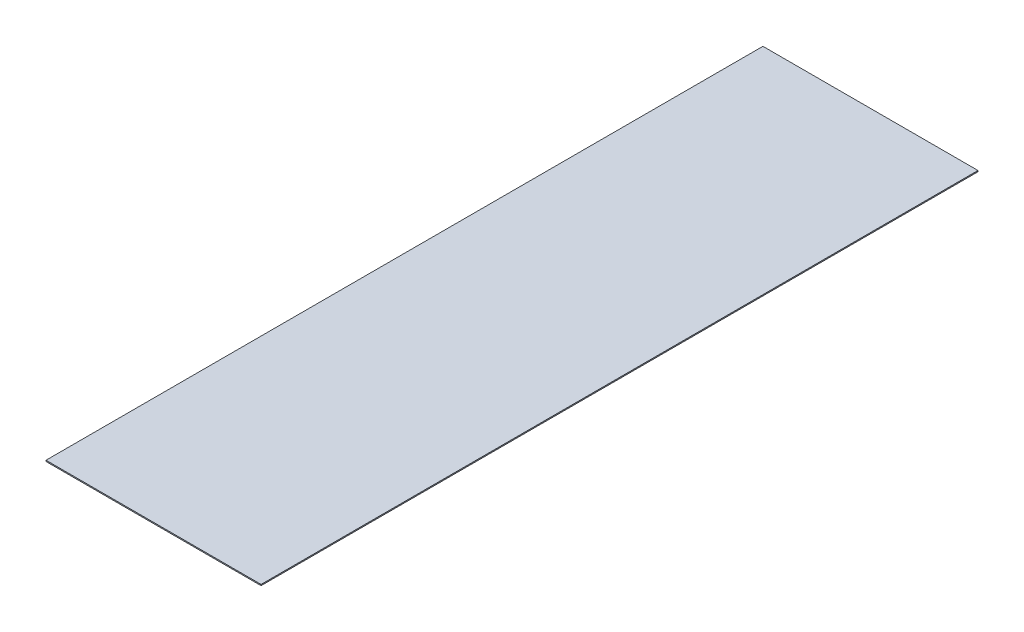
ISO-10303-21;
HEADER;
FILE_DESCRIPTION(('STEP AP214'),'2;1');
FILE_NAME('part.step','',(''),(''),'','','');
FILE_SCHEMA(('AUTOMOTIVE_DESIGN { 1 0 10303 214 1 1 1 1 }'));
ENDSEC;
DATA;
#1=APPLICATION_CONTEXT('core data for automotive mechanical design processes');
#2=APPLICATION_PROTOCOL_DEFINITION('international standard','automotive_design',2000,#1);
#3=PRODUCT_CONTEXT('',#1,'mechanical');
#4=PRODUCT('Part','Part','',(#3));
#5=PRODUCT_RELATED_PRODUCT_CATEGORY('part','',(#4));
#6=PRODUCT_DEFINITION_FORMATION('','',#4);
#7=PRODUCT_DEFINITION_CONTEXT('part definition',#1,'design');
#8=PRODUCT_DEFINITION('design','',#6,#7);
#9=PRODUCT_DEFINITION_SHAPE('','',#8);
#10=(LENGTH_UNIT() NAMED_UNIT(*) SI_UNIT(.MILLI.,.METRE.));
#11=(NAMED_UNIT(*) PLANE_ANGLE_UNIT() SI_UNIT($,.RADIAN.));
#12=(NAMED_UNIT(*) SI_UNIT($,.STERADIAN.) SOLID_ANGLE_UNIT());
#13=UNCERTAINTY_MEASURE_WITH_UNIT(LENGTH_MEASURE(1.E-05),#10,'distance_accuracy_value','');
#14=(GEOMETRIC_REPRESENTATION_CONTEXT(3) GLOBAL_UNCERTAINTY_ASSIGNED_CONTEXT((#13)) GLOBAL_UNIT_ASSIGNED_CONTEXT((#10,
#11,#12)) REPRESENTATION_CONTEXT('',''));
#15=CARTESIAN_POINT('',(0.,0.,0.));
#16=DIRECTION('',(0.,0.,1.));
#17=DIRECTION('',(1.,0.,0.));
#18=AXIS2_PLACEMENT_3D('',#15,#16,#17);
#19=CARTESIAN_POINT('',(457.2,4.8,1524.));
#20=DIRECTION('',(-1.,0.,0.));
#21=DIRECTION('',(0.,0.,1.));
#22=AXIS2_PLACEMENT_3D('',#19,#20,#21);
#23=PLANE('',#22);
#24=DIRECTION('',(0.,0.,-1.));
#25=VECTOR('',#24,1.);
#26=CARTESIAN_POINT('',(457.2,0.,1524.));
#27=LINE('',#26,#25);
#28=CARTESIAN_POINT('',(457.2,0.,1524.));
#29=VERTEX_POINT('',#28);
#30=CARTESIAN_POINT('',(457.2,0.,-1524.));
#31=VERTEX_POINT('',#30);
#32=EDGE_CURVE('E96',#29,#31,#27,.T.);
#33=ORIENTED_EDGE('',*,*,#32,.T.);
#34=DIRECTION('',(0.,-1.,0.));
#35=VECTOR('',#34,1.);
#36=CARTESIAN_POINT('',(457.2,4.8,-1524.));
#37=LINE('',#36,#35);
#38=CARTESIAN_POINT('',(457.2,4.8,-1524.));
#39=VERTEX_POINT('',#38);
#40=EDGE_CURVE('E11',#39,#31,#37,.T.);
#41=ORIENTED_EDGE('',*,*,#40,.F.);
#42=DIRECTION('',(0.,0.,-1.));
#43=VECTOR('',#42,1.);
#44=CARTESIAN_POINT('',(457.2,4.8,1524.));
#45=LINE('',#44,#43);
#46=CARTESIAN_POINT('',(457.2,4.8,1524.));
#47=VERTEX_POINT('',#46);
#48=EDGE_CURVE('E84',#47,#39,#45,.T.);
#49=ORIENTED_EDGE('',*,*,#48,.F.);
#50=DIRECTION('',(0.,-1.,0.));
#51=VECTOR('',#50,1.);
#52=CARTESIAN_POINT('',(457.2,4.8,1524.));
#53=LINE('',#52,#51);
#54=EDGE_CURVE('E92',#47,#29,#53,.T.);
#55=ORIENTED_EDGE('',*,*,#54,.T.);
#56=EDGE_LOOP('',(#33,#41,#49,#55));
#57=FACE_BOUND('',#56,.T.);
#58=ADVANCED_FACE('F33',(#57),#23,.F.);
#59=CARTESIAN_POINT('',(-457.2,4.8,-1524.));
#60=DIRECTION('',(0.,0.,1.));
#61=DIRECTION('',(1.,0.,0.));
#62=AXIS2_PLACEMENT_3D('',#59,#60,#61);
#63=PLANE('',#62);
#64=DIRECTION('',(-1.,0.,0.));
#65=VECTOR('',#64,1.);
#66=CARTESIAN_POINT('',(-457.2,0.,-1524.));
#67=LINE('',#66,#65);
#68=CARTESIAN_POINT('',(-457.2,0.,-1524.));
#69=VERTEX_POINT('',#68);
#70=EDGE_CURVE('E88',#31,#69,#67,.T.);
#71=ORIENTED_EDGE('',*,*,#70,.T.);
#72=DIRECTION('',(0.,-1.,0.));
#73=VECTOR('',#72,1.);
#74=CARTESIAN_POINT('',(-457.2,4.8,-1524.));
#75=LINE('',#74,#73);
#76=CARTESIAN_POINT('',(-457.2,4.8,-1524.));
#77=VERTEX_POINT('',#76);
#78=EDGE_CURVE('E41',#77,#69,#75,.T.);
#79=ORIENTED_EDGE('',*,*,#78,.F.);
#80=DIRECTION('',(-1.,0.,0.));
#81=VECTOR('',#80,1.);
#82=CARTESIAN_POINT('',(-457.2,4.8,-1524.));
#83=LINE('',#82,#81);
#84=EDGE_CURVE('E79',#39,#77,#83,.T.);
#85=ORIENTED_EDGE('',*,*,#84,.F.);
#86=ORIENTED_EDGE('',*,*,#40,.T.);
#87=EDGE_LOOP('',(#71,#79,#85,#86));
#88=FACE_BOUND('',#87,.T.);
#89=ADVANCED_FACE('F87',(#88),#63,.F.);
#90=CARTESIAN_POINT('',(-457.2,4.8,1524.));
#91=DIRECTION('',(1.,0.,0.));
#92=DIRECTION('',(0.,0.,-1.));
#93=AXIS2_PLACEMENT_3D('',#90,#91,#92);
#94=PLANE('',#93);
#95=DIRECTION('',(0.,0.,1.));
#96=VECTOR('',#95,1.);
#97=CARTESIAN_POINT('',(-457.2,0.,1524.));
#98=LINE('',#97,#96);
#99=CARTESIAN_POINT('',(-457.2,0.,1524.));
#100=VERTEX_POINT('',#99);
#101=EDGE_CURVE('E66',#69,#100,#98,.T.);
#102=ORIENTED_EDGE('',*,*,#101,.T.);
#103=DIRECTION('',(0.,-1.,0.));
#104=VECTOR('',#103,1.);
#105=CARTESIAN_POINT('',(-457.2,4.8,1524.));
#106=LINE('',#105,#104);
#107=CARTESIAN_POINT('',(-457.2,4.8,1524.));
#108=VERTEX_POINT('',#107);
#109=EDGE_CURVE('E89',#108,#100,#106,.T.);
#110=ORIENTED_EDGE('',*,*,#109,.F.);
#111=DIRECTION('',(0.,0.,1.));
#112=VECTOR('',#111,1.);
#113=CARTESIAN_POINT('',(-457.2,4.8,1524.));
#114=LINE('',#113,#112);
#115=EDGE_CURVE('E82',#77,#108,#114,.T.);
#116=ORIENTED_EDGE('',*,*,#115,.F.);
#117=ORIENTED_EDGE('',*,*,#78,.T.);
#118=EDGE_LOOP('',(#102,#110,#116,#117));
#119=FACE_BOUND('',#118,.T.);
#120=ADVANCED_FACE('F90',(#119),#94,.F.);
#121=CARTESIAN_POINT('',(-457.2,4.8,1524.));
#122=DIRECTION('',(0.,0.,-1.));
#123=DIRECTION('',(-1.,0.,0.));
#124=AXIS2_PLACEMENT_3D('',#121,#122,#123);
#125=PLANE('',#124);
#126=DIRECTION('',(1.,0.,0.));
#127=VECTOR('',#126,1.);
#128=CARTESIAN_POINT('',(-457.2,0.,1524.));
#129=LINE('',#128,#127);
#130=EDGE_CURVE('E72',#100,#29,#129,.T.);
#131=ORIENTED_EDGE('',*,*,#130,.T.);
#132=ORIENTED_EDGE('',*,*,#54,.F.);
#133=DIRECTION('',(1.,0.,0.));
#134=VECTOR('',#133,1.);
#135=CARTESIAN_POINT('',(-457.2,4.8,1524.));
#136=LINE('',#135,#134);
#137=EDGE_CURVE('E49',#108,#47,#136,.T.);
#138=ORIENTED_EDGE('',*,*,#137,.F.);
#139=ORIENTED_EDGE('',*,*,#109,.T.);
#140=EDGE_LOOP('',(#131,#132,#138,#139));
#141=FACE_BOUND('',#140,.T.);
#142=ADVANCED_FACE('F103',(#141),#125,.F.);
#143=CARTESIAN_POINT('',(0.,4.8,0.));
#144=DIRECTION('',(0.,-1.,0.));
#145=DIRECTION('',(0.,0.,-1.));
#146=AXIS2_PLACEMENT_3D('',#143,#144,#145);
#147=PLANE('',#146);
#148=ORIENTED_EDGE('',*,*,#48,.T.);
#149=ORIENTED_EDGE('',*,*,#84,.T.);
#150=ORIENTED_EDGE('',*,*,#115,.T.);
#151=ORIENTED_EDGE('',*,*,#137,.T.);
#152=EDGE_LOOP('',(#148,#149,#150,#151));
#153=FACE_BOUND('',#152,.T.);
#154=ADVANCED_FACE('F80',(#153),#147,.F.);
#155=CARTESIAN_POINT('',(0.,0.,0.));
#156=DIRECTION('',(0.,-1.,0.));
#157=DIRECTION('',(0.,0.,-1.));
#158=AXIS2_PLACEMENT_3D('',#155,#156,#157);
#159=PLANE('',#158);
#160=ORIENTED_EDGE('',*,*,#32,.F.);
#161=ORIENTED_EDGE('',*,*,#130,.F.);
#162=ORIENTED_EDGE('',*,*,#101,.F.);
#163=ORIENTED_EDGE('',*,*,#70,.F.);
#164=EDGE_LOOP('',(#160,#161,#162,#163));
#165=FACE_BOUND('',#164,.T.);
#166=ADVANCED_FACE('F106',(#165),#159,.T.);
#167=CLOSED_SHELL('',(#58,#89,#120,#142,#154,#166));
#168=MANIFOLD_SOLID_BREP('B2',#167);
#169=ADVANCED_BREP_SHAPE_REPRESENTATION('',(#18,#168),#14);
#170=SHAPE_DEFINITION_REPRESENTATION(#9,#169);
ENDSEC;
END-ISO-10303-21;
